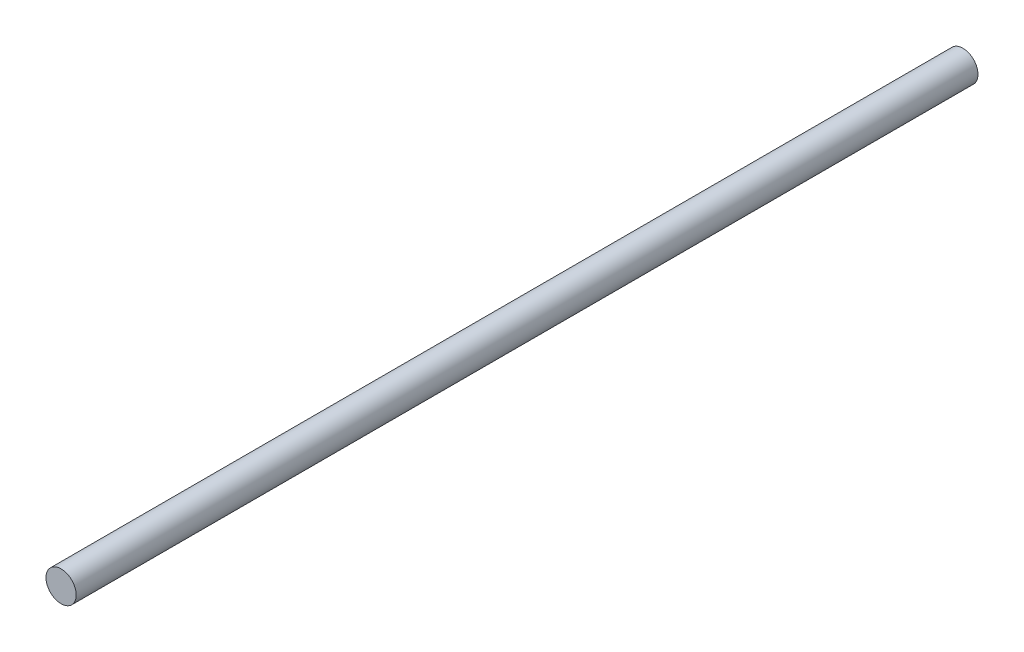
ISO-10303-21;
HEADER;
FILE_DESCRIPTION(('STEP AP214'),'2;1');
FILE_NAME('part.step','',(''),(''),'','','');
FILE_SCHEMA(('AUTOMOTIVE_DESIGN { 1 0 10303 214 1 1 1 1 }'));
ENDSEC;
DATA;
#1=APPLICATION_CONTEXT('core data for automotive mechanical design processes');
#2=APPLICATION_PROTOCOL_DEFINITION('international standard','automotive_design',2000,#1);
#3=PRODUCT_CONTEXT('',#1,'mechanical');
#4=PRODUCT('Part','Part','',(#3));
#5=PRODUCT_RELATED_PRODUCT_CATEGORY('part','',(#4));
#6=PRODUCT_DEFINITION_FORMATION('','',#4);
#7=PRODUCT_DEFINITION_CONTEXT('part definition',#1,'design');
#8=PRODUCT_DEFINITION('design','',#6,#7);
#9=PRODUCT_DEFINITION_SHAPE('','',#8);
#10=(LENGTH_UNIT() NAMED_UNIT(*) SI_UNIT(.MILLI.,.METRE.));
#11=(NAMED_UNIT(*) PLANE_ANGLE_UNIT() SI_UNIT($,.RADIAN.));
#12=(NAMED_UNIT(*) SI_UNIT($,.STERADIAN.) SOLID_ANGLE_UNIT());
#13=UNCERTAINTY_MEASURE_WITH_UNIT(LENGTH_MEASURE(1.E-05),#10,'distance_accuracy_value','');
#14=(GEOMETRIC_REPRESENTATION_CONTEXT(3) GLOBAL_UNCERTAINTY_ASSIGNED_CONTEXT((#13)) GLOBAL_UNIT_ASSIGNED_CONTEXT((#10,
#11,#12)) REPRESENTATION_CONTEXT('',''));
#15=CARTESIAN_POINT('',(0.,0.,0.));
#16=DIRECTION('',(0.,0.,1.));
#17=DIRECTION('',(1.,0.,0.));
#18=AXIS2_PLACEMENT_3D('',#15,#16,#17);
#19=CARTESIAN_POINT('',(0.,0.,149.09));
#20=DIRECTION('',(0.,0.,-1.));
#21=DIRECTION('',(-1.,0.,0.));
#22=AXIS2_PLACEMENT_3D('',#19,#20,#21);
#23=CYLINDRICAL_SURFACE('',#22,2.5);
#24=CARTESIAN_POINT('',(0.,0.,149.09));
#25=DIRECTION('',(0.,0.,1.));
#26=DIRECTION('',(1.,0.,0.));
#27=AXIS2_PLACEMENT_3D('',#24,#25,#26);
#28=CIRCLE('',#27,2.5);
#29=CARTESIAN_POINT('',(2.5,0.,149.09));
#30=VERTEX_POINT('',#29);
#31=EDGE_CURVE('E10',#30,#30,#28,.T.);
#32=ORIENTED_EDGE('',*,*,#31,.F.);
#33=EDGE_LOOP('',(#32));
#34=FACE_BOUND('',#33,.T.);
#35=CARTESIAN_POINT('',(0.,0.,0.));
#36=DIRECTION('',(0.,0.,1.));
#37=DIRECTION('',(1.,0.,0.));
#38=AXIS2_PLACEMENT_3D('',#35,#36,#37);
#39=CIRCLE('',#38,2.5);
#40=CARTESIAN_POINT('',(2.5,0.,0.));
#41=VERTEX_POINT('',#40);
#42=EDGE_CURVE('E38',#41,#41,#39,.T.);
#43=ORIENTED_EDGE('',*,*,#42,.T.);
#44=EDGE_LOOP('',(#43));
#45=FACE_BOUND('',#44,.T.);
#46=ADVANCED_FACE('F35',(#34,#45),#23,.T.);
#47=CARTESIAN_POINT('',(0.,0.,149.09));
#48=DIRECTION('',(0.,0.,1.));
#49=DIRECTION('',(1.,0.,0.));
#50=AXIS2_PLACEMENT_3D('',#47,#48,#49);
#51=PLANE('',#50);
#52=ORIENTED_EDGE('',*,*,#31,.T.);
#53=EDGE_LOOP('',(#52));
#54=FACE_BOUND('',#53,.T.);
#55=ADVANCED_FACE('F50',(#54),#51,.T.);
#56=CARTESIAN_POINT('',(0.,0.,0.));
#57=DIRECTION('',(0.,0.,1.));
#58=DIRECTION('',(1.,0.,0.));
#59=AXIS2_PLACEMENT_3D('',#56,#57,#58);
#60=PLANE('',#59);
#61=ORIENTED_EDGE('',*,*,#42,.F.);
#62=EDGE_LOOP('',(#61));
#63=FACE_BOUND('',#62,.T.);
#64=ADVANCED_FACE('F48',(#63),#60,.F.);
#65=CLOSED_SHELL('',(#46,#55,#64));
#66=MANIFOLD_SOLID_BREP('B2',#65);
#67=ADVANCED_BREP_SHAPE_REPRESENTATION('',(#18,#66),#14);
#68=SHAPE_DEFINITION_REPRESENTATION(#9,#67);
ENDSEC;
END-ISO-10303-21;
